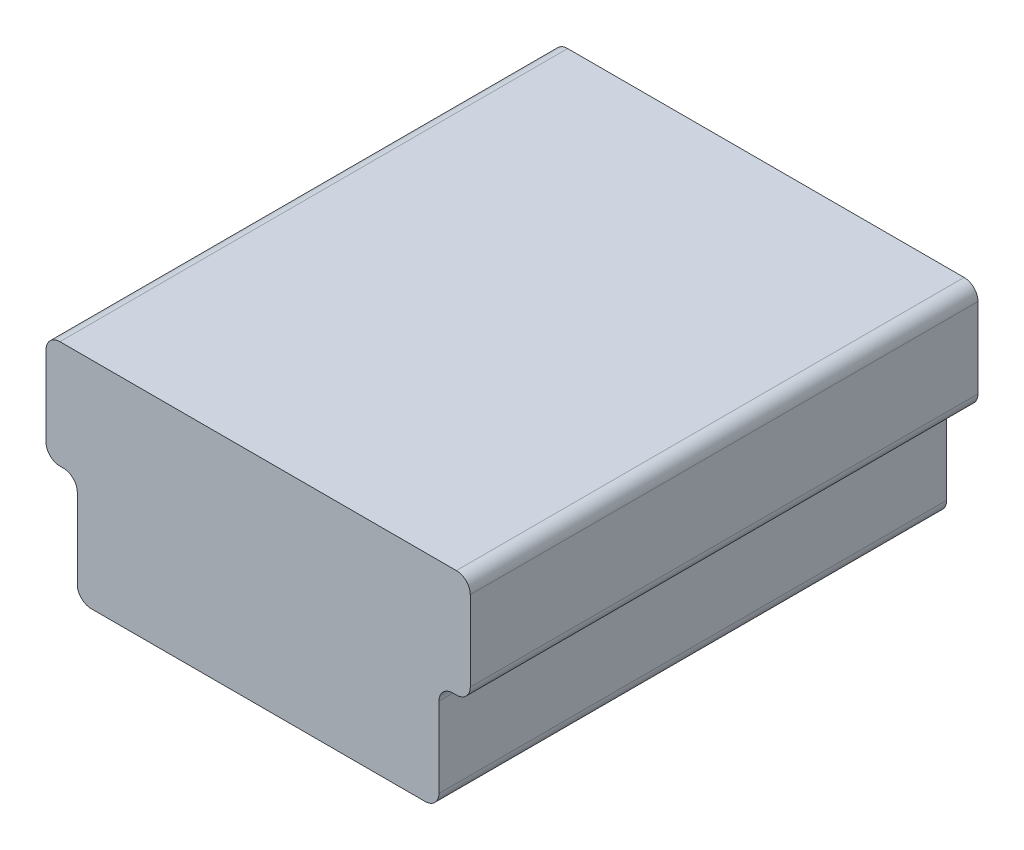
ISO-10303-21;
HEADER;
FILE_DESCRIPTION(('STEP AP214'),'2;1');
FILE_NAME('part.step','',(''),(''),'','','');
FILE_SCHEMA(('AUTOMOTIVE_DESIGN { 1 0 10303 214 1 1 1 1 }'));
ENDSEC;
DATA;
#1=APPLICATION_CONTEXT('core data for automotive mechanical design processes');
#2=APPLICATION_PROTOCOL_DEFINITION('international standard','automotive_design',2000,#1);
#3=PRODUCT_CONTEXT('',#1,'mechanical');
#4=PRODUCT('Part','Part','',(#3));
#5=PRODUCT_RELATED_PRODUCT_CATEGORY('part','',(#4));
#6=PRODUCT_DEFINITION_FORMATION('','',#4);
#7=PRODUCT_DEFINITION_CONTEXT('part definition',#1,'design');
#8=PRODUCT_DEFINITION('design','',#6,#7);
#9=PRODUCT_DEFINITION_SHAPE('','',#8);
#10=(LENGTH_UNIT() NAMED_UNIT(*) SI_UNIT(.MILLI.,.METRE.));
#11=(NAMED_UNIT(*) PLANE_ANGLE_UNIT() SI_UNIT($,.RADIAN.));
#12=(NAMED_UNIT(*) SI_UNIT($,.STERADIAN.) SOLID_ANGLE_UNIT());
#13=UNCERTAINTY_MEASURE_WITH_UNIT(LENGTH_MEASURE(1.E-05),#10,'distance_accuracy_value','');
#14=(GEOMETRIC_REPRESENTATION_CONTEXT(3) GLOBAL_UNCERTAINTY_ASSIGNED_CONTEXT((#13)) GLOBAL_UNIT_ASSIGNED_CONTEXT((#10,
#11,#12)) REPRESENTATION_CONTEXT('',''));
#15=CARTESIAN_POINT('',(0.,0.,0.));
#16=DIRECTION('',(0.,0.,1.));
#17=DIRECTION('',(1.,0.,0.));
#18=AXIS2_PLACEMENT_3D('',#15,#16,#17);
#19=CARTESIAN_POINT('',(-3.556,1.7145,8.89));
#20=DIRECTION('',(0.,0.,1.));
#21=DIRECTION('',(1.,0.,0.));
#22=AXIS2_PLACEMENT_3D('',#19,#20,#21);
#23=PLANE('',#22);
#24=CARTESIAN_POINT('',(-3.556,1.7145,8.89));
#25=DIRECTION('',(0.,0.,1.));
#26=DIRECTION('',(1.,0.,0.));
#27=AXIS2_PLACEMENT_3D('',#24,#25,#26);
#28=CIRCLE('',#27,0.635);
#29=CARTESIAN_POINT('',(-2.921,1.7145,8.89));
#30=VERTEX_POINT('',#29);
#31=CARTESIAN_POINT('',(-3.4925,2.3463170225627,8.89));
#32=VERTEX_POINT('',#31);
#33=EDGE_CURVE('E273',#30,#32,#28,.T.);
#34=ORIENTED_EDGE('',*,*,#33,.T.);
#35=DIRECTION('',(0.,1.,0.));
#36=VECTOR('',#35,1.);
#37=CARTESIAN_POINT('',(-3.4925,2.3463170225627,8.89));
#38=LINE('',#37,#36);
#39=CARTESIAN_POINT('',(-3.4925,3.556,8.89));
#40=VERTEX_POINT('',#39);
#41=EDGE_CURVE('E276',#32,#40,#38,.T.);
#42=ORIENTED_EDGE('',*,*,#41,.T.);
#43=DIRECTION('',(1.,0.,0.));
#44=VECTOR('',#43,1.);
#45=CARTESIAN_POINT('',(-3.4925,3.556,8.89));
#46=LINE('',#45,#44);
#47=CARTESIAN_POINT('',(3.4925,3.556,8.89));
#48=VERTEX_POINT('',#47);
#49=EDGE_CURVE('E280',#40,#48,#46,.T.);
#50=ORIENTED_EDGE('',*,*,#49,.T.);
#51=DIRECTION('',(0.,-1.,0.));
#52=VECTOR('',#51,1.);
#53=CARTESIAN_POINT('',(3.4925,3.556,8.89));
#54=LINE('',#53,#52);
#55=CARTESIAN_POINT('',(3.4925,2.3463170225627,8.89));
#56=VERTEX_POINT('',#55);
#57=EDGE_CURVE('E283',#48,#56,#54,.T.);
#58=ORIENTED_EDGE('',*,*,#57,.T.);
#59=CARTESIAN_POINT('',(3.556,1.7145,8.89));
#60=DIRECTION('',(0.,0.,1.));
#61=DIRECTION('',(1.,0.,0.));
#62=AXIS2_PLACEMENT_3D('',#59,#60,#61);
#63=CIRCLE('',#62,0.635);
#64=CARTESIAN_POINT('',(2.921,1.7145,8.89));
#65=VERTEX_POINT('',#64);
#66=EDGE_CURVE('E286',#56,#65,#63,.T.);
#67=ORIENTED_EDGE('',*,*,#66,.T.);
#68=DIRECTION('',(0.,-1.,0.));
#69=VECTOR('',#68,1.);
#70=CARTESIAN_POINT('',(2.921,1.7145,8.89));
#71=LINE('',#70,#69);
#72=CARTESIAN_POINT('',(2.921,0.381,8.89));
#73=VERTEX_POINT('',#72);
#74=EDGE_CURVE('E289',#65,#73,#71,.T.);
#75=ORIENTED_EDGE('',*,*,#74,.T.);
#76=DIRECTION('',(-1.,0.,0.));
#77=VECTOR('',#76,1.);
#78=CARTESIAN_POINT('',(2.921,0.381,8.89));
#79=LINE('',#78,#77);
#80=CARTESIAN_POINT('',(-2.921,0.381,8.89));
#81=VERTEX_POINT('',#80);
#82=EDGE_CURVE('E292',#73,#81,#79,.T.);
#83=ORIENTED_EDGE('',*,*,#82,.T.);
#84=DIRECTION('',(0.,1.,0.));
#85=VECTOR('',#84,1.);
#86=CARTESIAN_POINT('',(-2.921,0.381,8.89));
#87=LINE('',#86,#85);
#88=EDGE_CURVE('E295',#81,#30,#87,.T.);
#89=ORIENTED_EDGE('',*,*,#88,.T.);
#90=EDGE_LOOP('',(#34,#42,#50,#58,#67,#75,#83,#89));
#91=FACE_BOUND('',#90,.T.);
#92=DIRECTION('',(-1.,0.,0.));
#93=VECTOR('',#92,1.);
#94=CARTESIAN_POINT('',(-2.2225,1.016,8.89));
#95=LINE('',#94,#93);
#96=CARTESIAN_POINT('',(1.7144998984,1.016,8.89));
#97=VERTEX_POINT('',#96);
#98=CARTESIAN_POINT('',(-1.71449989839999,1.016,8.89));
#99=VERTEX_POINT('',#98);
#100=EDGE_CURVE('E263',#97,#99,#95,.T.);
#101=ORIENTED_EDGE('',*,*,#100,.F.);
#102=DIRECTION('',(-0.707106781186539,-0.707106781186556,0.));
#103=VECTOR('',#102,1.);
#104=CARTESIAN_POINT('',(-0.571500050799936,-1.26999994919999,8.89));
#105=LINE('',#104,#103);
#106=CARTESIAN_POINT('',(2.2225,1.52400010160001,8.89));
#107=VERTEX_POINT('',#106);
#108=EDGE_CURVE('E395',#97,#107,#105,.F.);
#109=ORIENTED_EDGE('',*,*,#108,.T.);
#110=DIRECTION('',(0.,-1.,0.));
#111=VECTOR('',#110,1.);
#112=CARTESIAN_POINT('',(2.2225,1.016,8.89));
#113=LINE('',#112,#111);
#114=CARTESIAN_POINT('',(2.2225,2.54,8.89));
#115=VERTEX_POINT('',#114);
#116=EDGE_CURVE('E269',#115,#107,#113,.T.);
#117=ORIENTED_EDGE('',*,*,#116,.F.);
#118=DIRECTION('',(1.,0.,0.));
#119=VECTOR('',#118,1.);
#120=CARTESIAN_POINT('',(2.2225,2.54,8.89));
#121=LINE('',#120,#119);
#122=CARTESIAN_POINT('',(-2.2225,2.54,8.89));
#123=VERTEX_POINT('',#122);
#124=EDGE_CURVE('E267',#123,#115,#121,.T.);
#125=ORIENTED_EDGE('',*,*,#124,.F.);
#126=DIRECTION('',(0.,1.,0.));
#127=VECTOR('',#126,1.);
#128=CARTESIAN_POINT('',(-2.2225,2.54,8.89));
#129=LINE('',#128,#127);
#130=CARTESIAN_POINT('',(-2.2225,1.5240001016,8.89));
#131=VERTEX_POINT('',#130);
#132=EDGE_CURVE('E248',#131,#123,#129,.T.);
#133=ORIENTED_EDGE('',*,*,#132,.F.);
#134=DIRECTION('',(-0.707106781186556,0.707106781186539,0.));
#135=VECTOR('',#134,1.);
#136=CARTESIAN_POINT('',(-2.98449994920002,2.2860000508,8.89));
#137=LINE('',#136,#135);
#138=EDGE_CURVE('E397',#131,#99,#137,.F.);
#139=ORIENTED_EDGE('',*,*,#138,.T.);
#140=EDGE_LOOP('',(#101,#109,#117,#125,#133,#139));
#141=FACE_BOUND('',#140,.T.);
#142=ADVANCED_FACE('F32',(#91,#141),#23,.F.);
#143=CARTESIAN_POINT('',(-3.8735,3.937,9.271));
#144=DIRECTION('',(-1.,0.,0.));
#145=DIRECTION('',(0.,0.,1.));
#146=AXIS2_PLACEMENT_3D('',#143,#144,#145);
#147=PLANE('',#146);
#148=DIRECTION('',(0.,-1.,0.));
#149=VECTOR('',#148,1.);
#150=CARTESIAN_POINT('',(-3.8735,3.937,9.271));
#151=LINE('',#150,#149);
#152=CARTESIAN_POINT('',(-3.8735,3.683,9.271));
#153=VERTEX_POINT('',#152);
#154=CARTESIAN_POINT('',(-3.8735,2.2225,9.271));
#155=VERTEX_POINT('',#154);
#156=EDGE_CURVE('E372',#153,#155,#151,.T.);
#157=ORIENTED_EDGE('',*,*,#156,.F.);
#158=DIRECTION('',(0.,0.,-1.));
#159=VECTOR('',#158,1.);
#160=CARTESIAN_POINT('',(-3.8735,3.683,0.));
#161=LINE('',#160,#159);
#162=CARTESIAN_POINT('',(-3.8735,3.683,0.));
#163=VERTEX_POINT('',#162);
#164=EDGE_CURVE('E452',#153,#163,#161,.T.);
#165=ORIENTED_EDGE('',*,*,#164,.T.);
#166=DIRECTION('',(0.,-1.,0.));
#167=VECTOR('',#166,1.);
#168=CARTESIAN_POINT('',(-3.8735,3.937,0.));
#169=LINE('',#168,#167);
#170=CARTESIAN_POINT('',(-3.8735,2.2225,0.));
#171=VERTEX_POINT('',#170);
#172=EDGE_CURVE('E368',#163,#171,#169,.T.);
#173=ORIENTED_EDGE('',*,*,#172,.T.);
#174=DIRECTION('',(0.,0.,-1.));
#175=VECTOR('',#174,1.);
#176=CARTESIAN_POINT('',(-3.8735,2.2225,9.271));
#177=LINE('',#176,#175);
#178=EDGE_CURVE('E450',#171,#155,#177,.F.);
#179=ORIENTED_EDGE('',*,*,#178,.T.);
#180=EDGE_LOOP('',(#157,#165,#173,#179));
#181=FACE_BOUND('',#180,.T.);
#182=ADVANCED_FACE('F528',(#181),#147,.T.);
#183=CARTESIAN_POINT('',(3.8735,3.937,9.271));
#184=DIRECTION('',(0.,0.,1.));
#185=DIRECTION('',(1.,0.,0.));
#186=AXIS2_PLACEMENT_3D('',#183,#184,#185);
#187=PLANE('',#186);
#188=DIRECTION('',(0.,-1.,0.));
#189=VECTOR('',#188,1.);
#190=CARTESIAN_POINT('',(3.8735,3.937,9.271));
#191=LINE('',#190,#189);
#192=CARTESIAN_POINT('',(3.8735,3.683,9.271));
#193=VERTEX_POINT('',#192);
#194=CARTESIAN_POINT('',(3.8735,2.2225,9.271));
#195=VERTEX_POINT('',#194);
#196=EDGE_CURVE('E376',#193,#195,#191,.T.);
#197=ORIENTED_EDGE('',*,*,#196,.F.);
#198=CARTESIAN_POINT('',(3.6195,3.683,9.271));
#199=DIRECTION('',(0.,0.,1.));
#200=DIRECTION('',(1.,0.,0.));
#201=AXIS2_PLACEMENT_3D('',#198,#199,#200);
#202=CIRCLE('',#201,0.254000000000001);
#203=CARTESIAN_POINT('',(3.6195,3.937,9.271));
#204=VERTEX_POINT('',#203);
#205=EDGE_CURVE('E415',#193,#204,#202,.T.);
#206=ORIENTED_EDGE('',*,*,#205,.T.);
#207=DIRECTION('',(-1.,0.,0.));
#208=VECTOR('',#207,1.);
#209=CARTESIAN_POINT('',(3.8735,3.937,9.271));
#210=LINE('',#209,#208);
#211=CARTESIAN_POINT('',(-3.6195,3.937,9.271));
#212=VERTEX_POINT('',#211);
#213=EDGE_CURVE('E364',#204,#212,#210,.T.);
#214=ORIENTED_EDGE('',*,*,#213,.T.);
#215=CARTESIAN_POINT('',(-3.6195,3.683,9.271));
#216=DIRECTION('',(0.,0.,1.));
#217=DIRECTION('',(1.,0.,0.));
#218=AXIS2_PLACEMENT_3D('',#215,#216,#217);
#219=CIRCLE('',#218,0.254000000000001);
#220=EDGE_CURVE('E409',#212,#153,#219,.T.);
#221=ORIENTED_EDGE('',*,*,#220,.T.);
#222=ORIENTED_EDGE('',*,*,#156,.T.);
#223=CARTESIAN_POINT('',(-3.6195,2.2225,9.271));
#224=DIRECTION('',(0.,0.,1.));
#225=DIRECTION('',(1.,0.,0.));
#226=AXIS2_PLACEMENT_3D('',#223,#224,#225);
#227=CIRCLE('',#226,0.254000000000001);
#228=CARTESIAN_POINT('',(-3.6195,1.9685,9.271));
#229=VERTEX_POINT('',#228);
#230=EDGE_CURVE('E405',#155,#229,#227,.T.);
#231=ORIENTED_EDGE('',*,*,#230,.T.);
#232=DIRECTION('',(1.,0.,0.));
#233=VECTOR('',#232,1.);
#234=CARTESIAN_POINT('',(-3.8735,1.9685,9.271));
#235=LINE('',#234,#233);
#236=CARTESIAN_POINT('',(-3.556,1.9685,9.271));
#237=VERTEX_POINT('',#236);
#238=EDGE_CURVE('E337',#229,#237,#235,.T.);
#239=ORIENTED_EDGE('',*,*,#238,.T.);
#240=CARTESIAN_POINT('',(-3.556,1.7145,9.271));
#241=DIRECTION('',(0.,0.,1.));
#242=DIRECTION('',(1.,0.,0.));
#243=AXIS2_PLACEMENT_3D('',#240,#241,#242);
#244=CIRCLE('',#243,0.254000000000001);
#245=CARTESIAN_POINT('',(-3.302,1.7145,9.271));
#246=VERTEX_POINT('',#245);
#247=EDGE_CURVE('E11',#237,#246,#244,.F.);
#248=ORIENTED_EDGE('',*,*,#247,.T.);
#249=DIRECTION('',(0.,-1.,0.));
#250=VECTOR('',#249,1.);
#251=CARTESIAN_POINT('',(-3.302,1.9685,9.271));
#252=LINE('',#251,#250);
#253=CARTESIAN_POINT('',(-3.302,0.254000000000001,9.271));
#254=VERTEX_POINT('',#253);
#255=EDGE_CURVE('E340',#246,#254,#252,.T.);
#256=ORIENTED_EDGE('',*,*,#255,.T.);
#257=CARTESIAN_POINT('',(-3.048,0.254000000000001,9.271));
#258=DIRECTION('',(0.,0.,1.));
#259=DIRECTION('',(1.,0.,0.));
#260=AXIS2_PLACEMENT_3D('',#257,#258,#259);
#261=CIRCLE('',#260,0.254000000000001);
#262=CARTESIAN_POINT('',(-3.048,0.,9.271));
#263=VERTEX_POINT('',#262);
#264=EDGE_CURVE('E411',#254,#263,#261,.T.);
#265=ORIENTED_EDGE('',*,*,#264,.T.);
#266=DIRECTION('',(-1.,0.,0.));
#267=VECTOR('',#266,1.);
#268=CARTESIAN_POINT('',(3.8735,0.,9.271));
#269=LINE('',#268,#267);
#270=CARTESIAN_POINT('',(3.048,0.,9.271));
#271=VERTEX_POINT('',#270);
#272=EDGE_CURVE('E365',#271,#263,#269,.T.);
#273=ORIENTED_EDGE('',*,*,#272,.F.);
#274=CARTESIAN_POINT('',(3.048,0.254000000000001,9.271));
#275=DIRECTION('',(0.,0.,1.));
#276=DIRECTION('',(1.,0.,0.));
#277=AXIS2_PLACEMENT_3D('',#274,#275,#276);
#278=CIRCLE('',#277,0.254000000000001);
#279=CARTESIAN_POINT('',(3.302,0.254000000000001,9.271));
#280=VERTEX_POINT('',#279);
#281=EDGE_CURVE('E407',#271,#280,#278,.T.);
#282=ORIENTED_EDGE('',*,*,#281,.T.);
#283=DIRECTION('',(0.,1.,0.));
#284=VECTOR('',#283,1.);
#285=CARTESIAN_POINT('',(3.302,0.,9.271));
#286=LINE('',#285,#284);
#287=CARTESIAN_POINT('',(3.302,1.7145,9.271));
#288=VERTEX_POINT('',#287);
#289=EDGE_CURVE('E349',#280,#288,#286,.T.);
#290=ORIENTED_EDGE('',*,*,#289,.T.);
#291=CARTESIAN_POINT('',(3.556,1.7145,9.271));
#292=DIRECTION('',(0.,0.,1.));
#293=DIRECTION('',(1.,0.,0.));
#294=AXIS2_PLACEMENT_3D('',#291,#292,#293);
#295=CIRCLE('',#294,0.254000000000001);
#296=CARTESIAN_POINT('',(3.556,1.9685,9.271));
#297=VERTEX_POINT('',#296);
#298=EDGE_CURVE('E462',#288,#297,#295,.F.);
#299=ORIENTED_EDGE('',*,*,#298,.T.);
#300=DIRECTION('',(1.,0.,0.));
#301=VECTOR('',#300,1.);
#302=CARTESIAN_POINT('',(3.302,1.9685,9.271));
#303=LINE('',#302,#301);
#304=CARTESIAN_POINT('',(3.6195,1.9685,9.271));
#305=VERTEX_POINT('',#304);
#306=EDGE_CURVE('E352',#297,#305,#303,.T.);
#307=ORIENTED_EDGE('',*,*,#306,.T.);
#308=CARTESIAN_POINT('',(3.6195,2.2225,9.271));
#309=DIRECTION('',(0.,0.,1.));
#310=DIRECTION('',(1.,0.,0.));
#311=AXIS2_PLACEMENT_3D('',#308,#309,#310);
#312=CIRCLE('',#311,0.254000000000001);
#313=EDGE_CURVE('E413',#305,#195,#312,.T.);
#314=ORIENTED_EDGE('',*,*,#313,.T.);
#315=EDGE_LOOP('',(#197,#206,#214,#221,#222,#231,#239,#248,#256,#265,#273,#282,#290,#299,#307,#314));
#316=FACE_BOUND('',#315,.T.);
#317=ADVANCED_FACE('F478',(#316),#187,.T.);
#318=CARTESIAN_POINT('',(3.8735,3.937,0.));
#319=DIRECTION('',(1.,0.,0.));
#320=DIRECTION('',(0.,0.,-1.));
#321=AXIS2_PLACEMENT_3D('',#318,#319,#320);
#322=PLANE('',#321);
#323=DIRECTION('',(0.,-1.,0.));
#324=VECTOR('',#323,1.);
#325=CARTESIAN_POINT('',(3.8735,3.937,0.));
#326=LINE('',#325,#324);
#327=CARTESIAN_POINT('',(3.8735,3.683,0.));
#328=VERTEX_POINT('',#327);
#329=CARTESIAN_POINT('',(3.8735,2.2225,0.));
#330=VERTEX_POINT('',#329);
#331=EDGE_CURVE('E379',#328,#330,#326,.T.);
#332=ORIENTED_EDGE('',*,*,#331,.F.);
#333=DIRECTION('',(0.,0.,1.));
#334=VECTOR('',#333,1.);
#335=CARTESIAN_POINT('',(3.8735,3.683,9.271));
#336=LINE('',#335,#334);
#337=EDGE_CURVE('E402',#328,#193,#336,.T.);
#338=ORIENTED_EDGE('',*,*,#337,.T.);
#339=ORIENTED_EDGE('',*,*,#196,.T.);
#340=DIRECTION('',(0.,0.,-1.));
#341=VECTOR('',#340,1.);
#342=CARTESIAN_POINT('',(3.8735,2.2225,0.));
#343=LINE('',#342,#341);
#344=EDGE_CURVE('E399',#195,#330,#343,.T.);
#345=ORIENTED_EDGE('',*,*,#344,.T.);
#346=EDGE_LOOP('',(#332,#338,#339,#345));
#347=FACE_BOUND('',#346,.T.);
#348=ADVANCED_FACE('F510',(#347),#322,.T.);
#349=CARTESIAN_POINT('',(-3.8735,3.937,0.));
#350=DIRECTION('',(0.,0.,-1.));
#351=DIRECTION('',(-1.,0.,0.));
#352=AXIS2_PLACEMENT_3D('',#349,#350,#351);
#353=PLANE('',#352);
#354=CARTESIAN_POINT('',(-3.556,1.7145,0.));
#355=DIRECTION('',(0.,0.,1.));
#356=DIRECTION('',(1.,0.,0.));
#357=AXIS2_PLACEMENT_3D('',#354,#355,#356);
#358=CIRCLE('',#357,0.635);
#359=CARTESIAN_POINT('',(-2.921,1.7145,0.));
#360=VERTEX_POINT('',#359);
#361=CARTESIAN_POINT('',(-3.4925,2.3463170225627,0.));
#362=VERTEX_POINT('',#361);
#363=EDGE_CURVE('E252',#360,#362,#358,.T.);
#364=ORIENTED_EDGE('',*,*,#363,.F.);
#365=DIRECTION('',(0.,1.,0.));
#366=VECTOR('',#365,1.);
#367=CARTESIAN_POINT('',(-2.921,0.381,0.));
#368=LINE('',#367,#366);
#369=CARTESIAN_POINT('',(-2.921,0.381,0.));
#370=VERTEX_POINT('',#369);
#371=EDGE_CURVE('E277',#370,#360,#368,.T.);
#372=ORIENTED_EDGE('',*,*,#371,.F.);
#373=DIRECTION('',(-1.,0.,0.));
#374=VECTOR('',#373,1.);
#375=CARTESIAN_POINT('',(2.921,0.381,0.));
#376=LINE('',#375,#374);
#377=CARTESIAN_POINT('',(2.921,0.381,0.));
#378=VERTEX_POINT('',#377);
#379=EDGE_CURVE('E315',#378,#370,#376,.T.);
#380=ORIENTED_EDGE('',*,*,#379,.F.);
#381=DIRECTION('',(0.,-1.,0.));
#382=VECTOR('',#381,1.);
#383=CARTESIAN_POINT('',(2.921,1.7145,0.));
#384=LINE('',#383,#382);
#385=CARTESIAN_POINT('',(2.921,1.7145,0.));
#386=VERTEX_POINT('',#385);
#387=EDGE_CURVE('E312',#386,#378,#384,.T.);
#388=ORIENTED_EDGE('',*,*,#387,.F.);
#389=CARTESIAN_POINT('',(3.556,1.7145,0.));
#390=DIRECTION('',(0.,0.,1.));
#391=DIRECTION('',(1.,0.,0.));
#392=AXIS2_PLACEMENT_3D('',#389,#390,#391);
#393=CIRCLE('',#392,0.635);
#394=CARTESIAN_POINT('',(3.4925,2.3463170225627,0.));
#395=VERTEX_POINT('',#394);
#396=EDGE_CURVE('E309',#395,#386,#393,.T.);
#397=ORIENTED_EDGE('',*,*,#396,.F.);
#398=DIRECTION('',(0.,-1.,0.));
#399=VECTOR('',#398,1.);
#400=CARTESIAN_POINT('',(3.4925,3.556,0.));
#401=LINE('',#400,#399);
#402=CARTESIAN_POINT('',(3.4925,3.556,0.));
#403=VERTEX_POINT('',#402);
#404=EDGE_CURVE('E306',#403,#395,#401,.T.);
#405=ORIENTED_EDGE('',*,*,#404,.F.);
#406=DIRECTION('',(1.,0.,0.));
#407=VECTOR('',#406,1.);
#408=CARTESIAN_POINT('',(-3.4925,3.556,0.));
#409=LINE('',#408,#407);
#410=CARTESIAN_POINT('',(-3.4925,3.556,0.));
#411=VERTEX_POINT('',#410);
#412=EDGE_CURVE('E303',#411,#403,#409,.T.);
#413=ORIENTED_EDGE('',*,*,#412,.F.);
#414=DIRECTION('',(0.,1.,0.));
#415=VECTOR('',#414,1.);
#416=CARTESIAN_POINT('',(-3.4925,2.3463170225627,0.));
#417=LINE('',#416,#415);
#418=EDGE_CURVE('E300',#362,#411,#417,.T.);
#419=ORIENTED_EDGE('',*,*,#418,.F.);
#420=EDGE_LOOP('',(#364,#372,#380,#388,#397,#405,#413,#419));
#421=FACE_BOUND('',#420,.T.);
#422=DIRECTION('',(1.,0.,0.));
#423=VECTOR('',#422,1.);
#424=CARTESIAN_POINT('',(-3.8735,3.937,0.));
#425=LINE('',#424,#423);
#426=CARTESIAN_POINT('',(-3.6195,3.937,0.));
#427=VERTEX_POINT('',#426);
#428=CARTESIAN_POINT('',(3.6195,3.937,0.));
#429=VERTEX_POINT('',#428);
#430=EDGE_CURVE('E361',#427,#429,#425,.T.);
#431=ORIENTED_EDGE('',*,*,#430,.T.);
#432=CARTESIAN_POINT('',(3.6195,3.683,0.));
#433=DIRECTION('',(0.,0.,-1.));
#434=DIRECTION('',(-1.,0.,0.));
#435=AXIS2_PLACEMENT_3D('',#432,#433,#434);
#436=CIRCLE('',#435,0.254000000000001);
#437=EDGE_CURVE('E429',#429,#328,#436,.T.);
#438=ORIENTED_EDGE('',*,*,#437,.T.);
#439=ORIENTED_EDGE('',*,*,#331,.T.);
#440=CARTESIAN_POINT('',(3.6195,2.2225,0.));
#441=DIRECTION('',(0.,0.,-1.));
#442=DIRECTION('',(-1.,0.,0.));
#443=AXIS2_PLACEMENT_3D('',#440,#441,#442);
#444=CIRCLE('',#443,0.254000000000001);
#445=CARTESIAN_POINT('',(3.6195,1.9685,0.));
#446=VERTEX_POINT('',#445);
#447=EDGE_CURVE('E427',#330,#446,#444,.T.);
#448=ORIENTED_EDGE('',*,*,#447,.T.);
#449=DIRECTION('',(1.,0.,0.));
#450=VECTOR('',#449,1.);
#451=CARTESIAN_POINT('',(3.302,1.9685,0.));
#452=LINE('',#451,#450);
#453=CARTESIAN_POINT('',(3.556,1.9685,0.));
#454=VERTEX_POINT('',#453);
#455=EDGE_CURVE('E353',#454,#446,#452,.T.);
#456=ORIENTED_EDGE('',*,*,#455,.F.);
#457=CARTESIAN_POINT('',(3.556,1.7145,0.));
#458=DIRECTION('',(0.,0.,-1.));
#459=DIRECTION('',(-1.,0.,0.));
#460=AXIS2_PLACEMENT_3D('',#457,#458,#459);
#461=CIRCLE('',#460,0.254000000000001);
#462=CARTESIAN_POINT('',(3.302,1.7145,0.));
#463=VERTEX_POINT('',#462);
#464=EDGE_CURVE('E460',#454,#463,#461,.F.);
#465=ORIENTED_EDGE('',*,*,#464,.T.);
#466=DIRECTION('',(0.,1.,0.));
#467=VECTOR('',#466,1.);
#468=CARTESIAN_POINT('',(3.302,0.,0.));
#469=LINE('',#468,#467);
#470=CARTESIAN_POINT('',(3.302,0.254000000000001,0.));
#471=VERTEX_POINT('',#470);
#472=EDGE_CURVE('E344',#471,#463,#469,.T.);
#473=ORIENTED_EDGE('',*,*,#472,.F.);
#474=CARTESIAN_POINT('',(3.048,0.254000000000001,0.));
#475=DIRECTION('',(0.,0.,-1.));
#476=DIRECTION('',(-1.,0.,0.));
#477=AXIS2_PLACEMENT_3D('',#474,#475,#476);
#478=CIRCLE('',#477,0.254000000000001);
#479=CARTESIAN_POINT('',(3.048,0.,0.));
#480=VERTEX_POINT('',#479);
#481=EDGE_CURVE('E47',#471,#480,#478,.T.);
#482=ORIENTED_EDGE('',*,*,#481,.T.);
#483=DIRECTION('',(1.,0.,0.));
#484=VECTOR('',#483,1.);
#485=CARTESIAN_POINT('',(-3.8735,0.,0.));
#486=LINE('',#485,#484);
#487=CARTESIAN_POINT('',(-3.048,0.,0.));
#488=VERTEX_POINT('',#487);
#489=EDGE_CURVE('E356',#488,#480,#486,.T.);
#490=ORIENTED_EDGE('',*,*,#489,.F.);
#491=CARTESIAN_POINT('',(-3.048,0.254000000000001,0.));
#492=DIRECTION('',(0.,0.,-1.));
#493=DIRECTION('',(-1.,0.,0.));
#494=AXIS2_PLACEMENT_3D('',#491,#492,#493);
#495=CIRCLE('',#494,0.254000000000001);
#496=CARTESIAN_POINT('',(-3.302,0.254000000000001,0.));
#497=VERTEX_POINT('',#496);
#498=EDGE_CURVE('E55',#488,#497,#495,.T.);
#499=ORIENTED_EDGE('',*,*,#498,.T.);
#500=DIRECTION('',(0.,-1.,0.));
#501=VECTOR('',#500,1.);
#502=CARTESIAN_POINT('',(-3.302,1.9685,0.));
#503=LINE('',#502,#501);
#504=CARTESIAN_POINT('',(-3.302,1.7145,0.));
#505=VERTEX_POINT('',#504);
#506=EDGE_CURVE('E341',#505,#497,#503,.T.);
#507=ORIENTED_EDGE('',*,*,#506,.F.);
#508=CARTESIAN_POINT('',(-3.556,1.7145,0.));
#509=DIRECTION('',(0.,0.,-1.));
#510=DIRECTION('',(-1.,0.,0.));
#511=AXIS2_PLACEMENT_3D('',#508,#509,#510);
#512=CIRCLE('',#511,0.254000000000001);
#513=CARTESIAN_POINT('',(-3.556,1.9685,0.));
#514=VERTEX_POINT('',#513);
#515=EDGE_CURVE('E40',#505,#514,#512,.F.);
#516=ORIENTED_EDGE('',*,*,#515,.T.);
#517=DIRECTION('',(1.,0.,0.));
#518=VECTOR('',#517,1.);
#519=CARTESIAN_POINT('',(-3.8735,1.9685,0.));
#520=LINE('',#519,#518);
#521=CARTESIAN_POINT('',(-3.6195,1.9685,0.));
#522=VERTEX_POINT('',#521);
#523=EDGE_CURVE('E322',#522,#514,#520,.T.);
#524=ORIENTED_EDGE('',*,*,#523,.F.);
#525=CARTESIAN_POINT('',(-3.6195,2.2225,0.));
#526=DIRECTION('',(0.,0.,-1.));
#527=DIRECTION('',(-1.,0.,0.));
#528=AXIS2_PLACEMENT_3D('',#525,#526,#527);
#529=CIRCLE('',#528,0.254000000000001);
#530=EDGE_CURVE('E421',#522,#171,#529,.T.);
#531=ORIENTED_EDGE('',*,*,#530,.T.);
#532=ORIENTED_EDGE('',*,*,#172,.F.);
#533=CARTESIAN_POINT('',(-3.6195,3.683,0.));
#534=DIRECTION('',(0.,0.,-1.));
#535=DIRECTION('',(-1.,0.,0.));
#536=AXIS2_PLACEMENT_3D('',#533,#534,#535);
#537=CIRCLE('',#536,0.254000000000001);
#538=EDGE_CURVE('E424',#163,#427,#537,.T.);
#539=ORIENTED_EDGE('',*,*,#538,.T.);
#540=EDGE_LOOP('',(#431,#438,#439,#448,#456,#465,#473,#482,#490,#499,#507,#516,#524,#531,#532,#539));
#541=FACE_BOUND('',#540,.T.);
#542=ADVANCED_FACE('F465',(#421,#541),#353,.T.);
#543=CARTESIAN_POINT('',(-3.8735,3.937,0.));
#544=DIRECTION('',(0.,-1.,0.));
#545=DIRECTION('',(0.,0.,-1.));
#546=AXIS2_PLACEMENT_3D('',#543,#544,#545);
#547=PLANE('',#546);
#548=ORIENTED_EDGE('',*,*,#213,.F.);
#549=DIRECTION('',(0.,0.,1.));
#550=VECTOR('',#549,1.);
#551=CARTESIAN_POINT('',(3.6195,3.937,0.));
#552=LINE('',#551,#550);
#553=EDGE_CURVE('E419',#204,#429,#552,.F.);
#554=ORIENTED_EDGE('',*,*,#553,.T.);
#555=ORIENTED_EDGE('',*,*,#430,.F.);
#556=DIRECTION('',(0.,0.,-1.));
#557=VECTOR('',#556,1.);
#558=CARTESIAN_POINT('',(-3.6195,3.937,9.271));
#559=LINE('',#558,#557);
#560=EDGE_CURVE('E417',#427,#212,#559,.F.);
#561=ORIENTED_EDGE('',*,*,#560,.T.);
#562=EDGE_LOOP('',(#548,#554,#555,#561));
#563=FACE_BOUND('',#562,.T.);
#564=ADVANCED_FACE('F519',(#563),#547,.F.);
#565=CARTESIAN_POINT('',(-3.8735,0.,0.));
#566=DIRECTION('',(0.,-1.,0.));
#567=DIRECTION('',(0.,0.,-1.));
#568=AXIS2_PLACEMENT_3D('',#565,#566,#567);
#569=PLANE('',#568);
#570=ORIENTED_EDGE('',*,*,#272,.T.);
#571=DIRECTION('',(0.,0.,-1.));
#572=VECTOR('',#571,1.);
#573=CARTESIAN_POINT('',(-3.048,0.,0.));
#574=LINE('',#573,#572);
#575=EDGE_CURVE('E438',#263,#488,#574,.T.);
#576=ORIENTED_EDGE('',*,*,#575,.T.);
#577=ORIENTED_EDGE('',*,*,#489,.T.);
#578=DIRECTION('',(0.,0.,-1.));
#579=VECTOR('',#578,1.);
#580=CARTESIAN_POINT('',(3.048,0.,9.271));
#581=LINE('',#580,#579);
#582=EDGE_CURVE('E436',#480,#271,#581,.F.);
#583=ORIENTED_EDGE('',*,*,#582,.T.);
#584=EDGE_LOOP('',(#570,#576,#577,#583));
#585=FACE_BOUND('',#584,.T.);
#586=ADVANCED_FACE('F486',(#585),#569,.T.);
#587=CARTESIAN_POINT('',(3.302,1.9685,9.271));
#588=DIRECTION('',(0.,1.,0.));
#589=DIRECTION('',(0.,0.,1.));
#590=AXIS2_PLACEMENT_3D('',#587,#588,#589);
#591=PLANE('',#590);
#592=ORIENTED_EDGE('',*,*,#455,.T.);
#593=DIRECTION('',(0.,0.,-1.));
#594=VECTOR('',#593,1.);
#595=CARTESIAN_POINT('',(3.6195,1.9685,9.271));
#596=LINE('',#595,#594);
#597=EDGE_CURVE('E434',#446,#305,#596,.F.);
#598=ORIENTED_EDGE('',*,*,#597,.T.);
#599=ORIENTED_EDGE('',*,*,#306,.F.);
#600=DIRECTION('',(0.,0.,-1.));
#601=VECTOR('',#600,1.);
#602=CARTESIAN_POINT('',(3.556,1.9685,0.));
#603=LINE('',#602,#601);
#604=EDGE_CURVE('E431',#297,#454,#603,.T.);
#605=ORIENTED_EDGE('',*,*,#604,.T.);
#606=EDGE_LOOP('',(#592,#598,#599,#605));
#607=FACE_BOUND('',#606,.T.);
#608=ADVANCED_FACE('F502',(#607),#591,.F.);
#609=CARTESIAN_POINT('',(3.302,0.,9.271));
#610=DIRECTION('',(-1.,0.,0.));
#611=DIRECTION('',(0.,-1.,0.));
#612=AXIS2_PLACEMENT_3D('',#609,#610,#611);
#613=PLANE('',#612);
#614=ORIENTED_EDGE('',*,*,#472,.T.);
#615=DIRECTION('',(0.,0.,-1.));
#616=VECTOR('',#615,1.);
#617=CARTESIAN_POINT('',(3.302,1.7145,9.271));
#618=LINE('',#617,#616);
#619=EDGE_CURVE('E448',#463,#288,#618,.F.);
#620=ORIENTED_EDGE('',*,*,#619,.T.);
#621=ORIENTED_EDGE('',*,*,#289,.F.);
#622=DIRECTION('',(0.,0.,-1.));
#623=VECTOR('',#622,1.);
#624=CARTESIAN_POINT('',(3.302,0.254000000000001,0.));
#625=LINE('',#624,#623);
#626=EDGE_CURVE('E445',#280,#471,#625,.T.);
#627=ORIENTED_EDGE('',*,*,#626,.T.);
#628=EDGE_LOOP('',(#614,#620,#621,#627));
#629=FACE_BOUND('',#628,.T.);
#630=ADVANCED_FACE('F494',(#629),#613,.F.);
#631=CARTESIAN_POINT('',(-3.302,1.9685,9.271));
#632=DIRECTION('',(1.,0.,0.));
#633=DIRECTION('',(0.,0.,-1.));
#634=AXIS2_PLACEMENT_3D('',#631,#632,#633);
#635=PLANE('',#634);
#636=ORIENTED_EDGE('',*,*,#506,.T.);
#637=DIRECTION('',(0.,0.,-1.));
#638=VECTOR('',#637,1.);
#639=CARTESIAN_POINT('',(-3.302,0.254000000000001,9.271));
#640=LINE('',#639,#638);
#641=EDGE_CURVE('E443',#497,#254,#640,.F.);
#642=ORIENTED_EDGE('',*,*,#641,.T.);
#643=ORIENTED_EDGE('',*,*,#255,.F.);
#644=DIRECTION('',(0.,0.,-1.));
#645=VECTOR('',#644,1.);
#646=CARTESIAN_POINT('',(-3.302,1.7145,0.));
#647=LINE('',#646,#645);
#648=EDGE_CURVE('E440',#246,#505,#647,.T.);
#649=ORIENTED_EDGE('',*,*,#648,.T.);
#650=EDGE_LOOP('',(#636,#642,#643,#649));
#651=FACE_BOUND('',#650,.T.);
#652=ADVANCED_FACE('F481',(#651),#635,.F.);
#653=CARTESIAN_POINT('',(-3.8735,1.9685,9.271));
#654=DIRECTION('',(0.,1.,0.));
#655=DIRECTION('',(0.,0.,1.));
#656=AXIS2_PLACEMENT_3D('',#653,#654,#655);
#657=PLANE('',#656);
#658=ORIENTED_EDGE('',*,*,#523,.T.);
#659=DIRECTION('',(0.,0.,-1.));
#660=VECTOR('',#659,1.);
#661=CARTESIAN_POINT('',(-3.556,1.9685,9.271));
#662=LINE('',#661,#660);
#663=EDGE_CURVE('E458',#514,#237,#662,.F.);
#664=ORIENTED_EDGE('',*,*,#663,.T.);
#665=ORIENTED_EDGE('',*,*,#238,.F.);
#666=DIRECTION('',(0.,0.,-1.));
#667=VECTOR('',#666,1.);
#668=CARTESIAN_POINT('',(-3.6195,1.9685,0.));
#669=LINE('',#668,#667);
#670=EDGE_CURVE('E455',#229,#522,#669,.T.);
#671=ORIENTED_EDGE('',*,*,#670,.T.);
#672=EDGE_LOOP('',(#658,#664,#665,#671));
#673=FACE_BOUND('',#672,.T.);
#674=ADVANCED_FACE('F470',(#673),#657,.F.);
#675=CARTESIAN_POINT('',(-3.556,1.7145,8.89));
#676=DIRECTION('',(0.,0.,-1.));
#677=DIRECTION('',(-1.,0.,0.));
#678=AXIS2_PLACEMENT_3D('',#675,#676,#677);
#679=CYLINDRICAL_SURFACE('',#678,0.635);
#680=ORIENTED_EDGE('',*,*,#363,.T.);
#681=DIRECTION('',(0.,0.,-1.));
#682=VECTOR('',#681,1.);
#683=CARTESIAN_POINT('',(-3.4925,2.3463170225627,8.89));
#684=LINE('',#683,#682);
#685=EDGE_CURVE('E298',#32,#362,#684,.T.);
#686=ORIENTED_EDGE('',*,*,#685,.F.);
#687=ORIENTED_EDGE('',*,*,#33,.F.);
#688=DIRECTION('',(0.,0.,-1.));
#689=VECTOR('',#688,1.);
#690=CARTESIAN_POINT('',(-2.921,1.7145,8.89));
#691=LINE('',#690,#689);
#692=EDGE_CURVE('E320',#30,#360,#691,.T.);
#693=ORIENTED_EDGE('',*,*,#692,.T.);
#694=EDGE_LOOP('',(#680,#686,#687,#693));
#695=FACE_BOUND('',#694,.T.);
#696=ADVANCED_FACE('F552',(#695),#679,.T.);
#697=CARTESIAN_POINT('',(-2.921,0.381,8.89));
#698=DIRECTION('',(-1.,0.,0.));
#699=DIRECTION('',(0.,0.,1.));
#700=AXIS2_PLACEMENT_3D('',#697,#698,#699);
#701=PLANE('',#700);
#702=ORIENTED_EDGE('',*,*,#371,.T.);
#703=ORIENTED_EDGE('',*,*,#692,.F.);
#704=ORIENTED_EDGE('',*,*,#88,.F.);
#705=DIRECTION('',(0.,0.,-1.));
#706=VECTOR('',#705,1.);
#707=CARTESIAN_POINT('',(-2.921,0.381,8.89));
#708=LINE('',#707,#706);
#709=EDGE_CURVE('E323',#81,#370,#708,.T.);
#710=ORIENTED_EDGE('',*,*,#709,.T.);
#711=EDGE_LOOP('',(#702,#703,#704,#710));
#712=FACE_BOUND('',#711,.T.);
#713=ADVANCED_FACE('F548',(#712),#701,.F.);
#714=CARTESIAN_POINT('',(2.921,0.381,8.89));
#715=DIRECTION('',(0.,-1.,0.));
#716=DIRECTION('',(1.,0.,0.));
#717=AXIS2_PLACEMENT_3D('',#714,#715,#716);
#718=PLANE('',#717);
#719=ORIENTED_EDGE('',*,*,#379,.T.);
#720=ORIENTED_EDGE('',*,*,#709,.F.);
#721=ORIENTED_EDGE('',*,*,#82,.F.);
#722=DIRECTION('',(0.,0.,-1.));
#723=VECTOR('',#722,1.);
#724=CARTESIAN_POINT('',(2.921,0.381,8.89));
#725=LINE('',#724,#723);
#726=EDGE_CURVE('E325',#73,#378,#725,.T.);
#727=ORIENTED_EDGE('',*,*,#726,.T.);
#728=EDGE_LOOP('',(#719,#720,#721,#727));
#729=FACE_BOUND('',#728,.T.);
#730=ADVANCED_FACE('F551',(#729),#718,.F.);
#731=CARTESIAN_POINT('',(2.921,1.7145,8.89));
#732=DIRECTION('',(1.,0.,0.));
#733=DIRECTION('',(0.,0.,-1.));
#734=AXIS2_PLACEMENT_3D('',#731,#732,#733);
#735=PLANE('',#734);
#736=ORIENTED_EDGE('',*,*,#387,.T.);
#737=ORIENTED_EDGE('',*,*,#726,.F.);
#738=ORIENTED_EDGE('',*,*,#74,.F.);
#739=DIRECTION('',(0.,0.,-1.));
#740=VECTOR('',#739,1.);
#741=CARTESIAN_POINT('',(2.921,1.7145,8.89));
#742=LINE('',#741,#740);
#743=EDGE_CURVE('E327',#65,#386,#742,.T.);
#744=ORIENTED_EDGE('',*,*,#743,.T.);
#745=EDGE_LOOP('',(#736,#737,#738,#744));
#746=FACE_BOUND('',#745,.T.);
#747=ADVANCED_FACE('F556',(#746),#735,.F.);
#748=CARTESIAN_POINT('',(3.556,1.7145,8.89));
#749=DIRECTION('',(0.,0.,-1.));
#750=DIRECTION('',(-1.,0.,0.));
#751=AXIS2_PLACEMENT_3D('',#748,#749,#750);
#752=CYLINDRICAL_SURFACE('',#751,0.635);
#753=ORIENTED_EDGE('',*,*,#396,.T.);
#754=ORIENTED_EDGE('',*,*,#743,.F.);
#755=ORIENTED_EDGE('',*,*,#66,.F.);
#756=DIRECTION('',(0.,0.,-1.));
#757=VECTOR('',#756,1.);
#758=CARTESIAN_POINT('',(3.4925,2.3463170225627,8.89));
#759=LINE('',#758,#757);
#760=EDGE_CURVE('E329',#56,#395,#759,.T.);
#761=ORIENTED_EDGE('',*,*,#760,.T.);
#762=EDGE_LOOP('',(#753,#754,#755,#761));
#763=FACE_BOUND('',#762,.T.);
#764=ADVANCED_FACE('F560',(#763),#752,.T.);
#765=CARTESIAN_POINT('',(3.4925,3.556,8.89));
#766=DIRECTION('',(1.,0.,0.));
#767=DIRECTION('',(0.,0.,-1.));
#768=AXIS2_PLACEMENT_3D('',#765,#766,#767);
#769=PLANE('',#768);
#770=ORIENTED_EDGE('',*,*,#404,.T.);
#771=ORIENTED_EDGE('',*,*,#760,.F.);
#772=ORIENTED_EDGE('',*,*,#57,.F.);
#773=DIRECTION('',(0.,0.,-1.));
#774=VECTOR('',#773,1.);
#775=CARTESIAN_POINT('',(3.4925,3.556,8.89));
#776=LINE('',#775,#774);
#777=EDGE_CURVE('E331',#48,#403,#776,.T.);
#778=ORIENTED_EDGE('',*,*,#777,.T.);
#779=EDGE_LOOP('',(#770,#771,#772,#778));
#780=FACE_BOUND('',#779,.T.);
#781=ADVANCED_FACE('F564',(#780),#769,.F.);
#782=CARTESIAN_POINT('',(-3.4925,3.556,8.89));
#783=DIRECTION('',(0.,1.,0.));
#784=DIRECTION('',(0.,0.,1.));
#785=AXIS2_PLACEMENT_3D('',#782,#783,#784);
#786=PLANE('',#785);
#787=ORIENTED_EDGE('',*,*,#412,.T.);
#788=ORIENTED_EDGE('',*,*,#777,.F.);
#789=ORIENTED_EDGE('',*,*,#49,.F.);
#790=DIRECTION('',(0.,0.,-1.));
#791=VECTOR('',#790,1.);
#792=CARTESIAN_POINT('',(-3.4925,3.556,8.89));
#793=LINE('',#792,#791);
#794=EDGE_CURVE('E333',#40,#411,#793,.T.);
#795=ORIENTED_EDGE('',*,*,#794,.T.);
#796=EDGE_LOOP('',(#787,#788,#789,#795));
#797=FACE_BOUND('',#796,.T.);
#798=ADVANCED_FACE('F568',(#797),#786,.F.);
#799=CARTESIAN_POINT('',(-3.4925,2.3463170225627,8.89));
#800=DIRECTION('',(-1.,0.,0.));
#801=DIRECTION('',(0.,0.,1.));
#802=AXIS2_PLACEMENT_3D('',#799,#800,#801);
#803=PLANE('',#802);
#804=ORIENTED_EDGE('',*,*,#418,.T.);
#805=ORIENTED_EDGE('',*,*,#794,.F.);
#806=ORIENTED_EDGE('',*,*,#41,.F.);
#807=ORIENTED_EDGE('',*,*,#685,.T.);
#808=EDGE_LOOP('',(#804,#805,#806,#807));
#809=FACE_BOUND('',#808,.T.);
#810=ADVANCED_FACE('F572',(#809),#803,.F.);
#811=CARTESIAN_POINT('',(-2.2225,1.016,0.888999999999999));
#812=DIRECTION('',(0.,1.,0.));
#813=DIRECTION('',(0.,0.,1.));
#814=AXIS2_PLACEMENT_3D('',#811,#812,#813);
#815=PLANE('',#814);
#816=DIRECTION('',(-1.,0.,0.));
#817=VECTOR('',#816,1.);
#818=CARTESIAN_POINT('',(-2.2225,1.016,0.888999999999999));
#819=LINE('',#818,#817);
#820=CARTESIAN_POINT('',(1.7144998984,1.016,0.888999999999999));
#821=VERTEX_POINT('',#820);
#822=CARTESIAN_POINT('',(-1.71449989839999,1.016,0.888999999999999));
#823=VERTEX_POINT('',#822);
#824=EDGE_CURVE('E242',#821,#823,#819,.T.);
#825=ORIENTED_EDGE('',*,*,#824,.F.);
#826=DIRECTION('',(0.,0.,1.));
#827=VECTOR('',#826,1.);
#828=CARTESIAN_POINT('',(1.7144998984,1.016,0.888999999999999));
#829=LINE('',#828,#827);
#830=EDGE_CURVE('E385',#821,#97,#829,.T.);
#831=ORIENTED_EDGE('',*,*,#830,.T.);
#832=ORIENTED_EDGE('',*,*,#100,.T.);
#833=DIRECTION('',(0.,0.,-1.));
#834=VECTOR('',#833,1.);
#835=CARTESIAN_POINT('',(-1.71449989839999,1.016,0.888999999999999));
#836=LINE('',#835,#834);
#837=EDGE_CURVE('E375',#99,#823,#836,.T.);
#838=ORIENTED_EDGE('',*,*,#837,.T.);
#839=EDGE_LOOP('',(#825,#831,#832,#838));
#840=FACE_BOUND('',#839,.T.);
#841=ADVANCED_FACE('F546',(#840),#815,.F.);
#842=CARTESIAN_POINT('',(-2.2225,2.54,0.888999999999999));
#843=DIRECTION('',(1.,0.,0.));
#844=DIRECTION('',(0.,0.,-1.));
#845=AXIS2_PLACEMENT_3D('',#842,#843,#844);
#846=PLANE('',#845);
#847=DIRECTION('',(0.,1.,0.));
#848=VECTOR('',#847,1.);
#849=CARTESIAN_POINT('',(-2.2225,2.54,0.888999999999999));
#850=LINE('',#849,#848);
#851=CARTESIAN_POINT('',(-2.2225,1.5240001016,0.888999999999999));
#852=VERTEX_POINT('',#851);
#853=CARTESIAN_POINT('',(-2.2225,2.54,0.888999999999999));
#854=VERTEX_POINT('',#853);
#855=EDGE_CURVE('E229',#852,#854,#850,.T.);
#856=ORIENTED_EDGE('',*,*,#855,.F.);
#857=DIRECTION('',(0.,0.,1.));
#858=VECTOR('',#857,1.);
#859=CARTESIAN_POINT('',(-2.2225,1.5240001016,0.888999999999999));
#860=LINE('',#859,#858);
#861=EDGE_CURVE('E393',#852,#131,#860,.T.);
#862=ORIENTED_EDGE('',*,*,#861,.T.);
#863=ORIENTED_EDGE('',*,*,#132,.T.);
#864=DIRECTION('',(0.,0.,1.));
#865=VECTOR('',#864,1.);
#866=CARTESIAN_POINT('',(-2.2225,2.54,0.888999999999999));
#867=LINE('',#866,#865);
#868=EDGE_CURVE('E245',#854,#123,#867,.T.);
#869=ORIENTED_EDGE('',*,*,#868,.F.);
#870=EDGE_LOOP('',(#856,#862,#863,#869));
#871=FACE_BOUND('',#870,.T.);
#872=ADVANCED_FACE('F246',(#871),#846,.F.);
#873=CARTESIAN_POINT('',(2.2225,2.54,0.888999999999999));
#874=DIRECTION('',(0.,-1.,0.));
#875=DIRECTION('',(0.,0.,-1.));
#876=AXIS2_PLACEMENT_3D('',#873,#874,#875);
#877=PLANE('',#876);
#878=ORIENTED_EDGE('',*,*,#124,.T.);
#879=DIRECTION('',(0.,0.,1.));
#880=VECTOR('',#879,1.);
#881=CARTESIAN_POINT('',(2.2225,2.54,0.888999999999999));
#882=LINE('',#881,#880);
#883=CARTESIAN_POINT('',(2.2225,2.54,0.888999999999999));
#884=VERTEX_POINT('',#883);
#885=EDGE_CURVE('E253',#884,#115,#882,.T.);
#886=ORIENTED_EDGE('',*,*,#885,.F.);
#887=DIRECTION('',(1.,0.,0.));
#888=VECTOR('',#887,1.);
#889=CARTESIAN_POINT('',(2.2225,2.54,0.888999999999999));
#890=LINE('',#889,#888);
#891=EDGE_CURVE('E234',#854,#884,#890,.T.);
#892=ORIENTED_EDGE('',*,*,#891,.F.);
#893=ORIENTED_EDGE('',*,*,#868,.T.);
#894=EDGE_LOOP('',(#878,#886,#892,#893));
#895=FACE_BOUND('',#894,.T.);
#896=ADVANCED_FACE('F255',(#895),#877,.F.);
#897=CARTESIAN_POINT('',(2.2225,1.016,0.888999999999999));
#898=DIRECTION('',(-1.,0.,0.));
#899=DIRECTION('',(0.,0.,1.));
#900=AXIS2_PLACEMENT_3D('',#897,#898,#899);
#901=PLANE('',#900);
#902=ORIENTED_EDGE('',*,*,#116,.T.);
#903=DIRECTION('',(0.,0.,-1.));
#904=VECTOR('',#903,1.);
#905=CARTESIAN_POINT('',(2.2225,1.52400010160001,0.888999999999999));
#906=LINE('',#905,#904);
#907=CARTESIAN_POINT('',(2.2225,1.52400010160001,0.888999999999999));
#908=VERTEX_POINT('',#907);
#909=EDGE_CURVE('E388',#107,#908,#906,.T.);
#910=ORIENTED_EDGE('',*,*,#909,.T.);
#911=DIRECTION('',(0.,-1.,0.));
#912=VECTOR('',#911,1.);
#913=CARTESIAN_POINT('',(2.2225,1.016,0.888999999999999));
#914=LINE('',#913,#912);
#915=EDGE_CURVE('E258',#884,#908,#914,.T.);
#916=ORIENTED_EDGE('',*,*,#915,.F.);
#917=ORIENTED_EDGE('',*,*,#885,.T.);
#918=EDGE_LOOP('',(#902,#910,#916,#917));
#919=FACE_BOUND('',#918,.T.);
#920=ADVANCED_FACE('F678',(#919),#901,.F.);
#921=CARTESIAN_POINT('',(2.2225,1.016,0.888999999999999));
#922=DIRECTION('',(0.,0.,1.));
#923=DIRECTION('',(1.,0.,0.));
#924=AXIS2_PLACEMENT_3D('',#921,#922,#923);
#925=PLANE('',#924);
#926=ORIENTED_EDGE('',*,*,#915,.T.);
#927=DIRECTION('',(0.707106781186539,0.707106781186556,0.));
#928=VECTOR('',#927,1.);
#929=CARTESIAN_POINT('',(1.7144998984,1.016,0.888999999999999));
#930=LINE('',#929,#928);
#931=EDGE_CURVE('E391',#908,#821,#930,.F.);
#932=ORIENTED_EDGE('',*,*,#931,.T.);
#933=ORIENTED_EDGE('',*,*,#824,.T.);
#934=DIRECTION('',(0.707106781186556,-0.707106781186539,0.));
#935=VECTOR('',#934,1.);
#936=CARTESIAN_POINT('',(-2.2225,1.5240001016,0.888999999999999));
#937=LINE('',#936,#935);
#938=EDGE_CURVE('E238',#823,#852,#937,.F.);
#939=ORIENTED_EDGE('',*,*,#938,.T.);
#940=ORIENTED_EDGE('',*,*,#855,.T.);
#941=ORIENTED_EDGE('',*,*,#891,.T.);
#942=EDGE_LOOP('',(#926,#932,#933,#939,#940,#941));
#943=FACE_BOUND('',#942,.T.);
#944=ADVANCED_FACE('F232',(#943),#925,.F.);
#945=CARTESIAN_POINT('',(1.7144998984,1.016,0.888999999999999));
#946=DIRECTION('',(-0.707106781186556,0.707106781186539,0.));
#947=DIRECTION('',(-0.707106781186539,-0.707106781186556,0.));
#948=AXIS2_PLACEMENT_3D('',#945,#946,#947);
#949=PLANE('',#948);
#950=ORIENTED_EDGE('',*,*,#931,.F.);
#951=ORIENTED_EDGE('',*,*,#909,.F.);
#952=ORIENTED_EDGE('',*,*,#108,.F.);
#953=ORIENTED_EDGE('',*,*,#830,.F.);
#954=EDGE_LOOP('',(#950,#951,#952,#953));
#955=FACE_BOUND('',#954,.T.);
#956=ADVANCED_FACE('F599',(#955),#949,.F.);
#957=CARTESIAN_POINT('',(-2.2225,1.5240001016,0.888999999999999));
#958=DIRECTION('',(0.707106781186539,0.707106781186556,0.));
#959=DIRECTION('',(-0.707106781186556,0.707106781186539,0.));
#960=AXIS2_PLACEMENT_3D('',#957,#958,#959);
#961=PLANE('',#960);
#962=ORIENTED_EDGE('',*,*,#938,.F.);
#963=ORIENTED_EDGE('',*,*,#837,.F.);
#964=ORIENTED_EDGE('',*,*,#138,.F.);
#965=ORIENTED_EDGE('',*,*,#861,.F.);
#966=EDGE_LOOP('',(#962,#963,#964,#965));
#967=FACE_BOUND('',#966,.T.);
#968=ADVANCED_FACE('F602',(#967),#961,.F.);
#969=CARTESIAN_POINT('',(3.6195,3.683,0.));
#970=DIRECTION('',(0.,0.,-1.));
#971=DIRECTION('',(-1.,0.,0.));
#972=AXIS2_PLACEMENT_3D('',#969,#970,#971);
#973=CYLINDRICAL_SURFACE('',#972,0.254000000000001);
#974=ORIENTED_EDGE('',*,*,#437,.F.);
#975=ORIENTED_EDGE('',*,*,#553,.F.);
#976=ORIENTED_EDGE('',*,*,#205,.F.);
#977=ORIENTED_EDGE('',*,*,#337,.F.);
#978=EDGE_LOOP('',(#974,#975,#976,#977));
#979=FACE_BOUND('',#978,.T.);
#980=ADVANCED_FACE('F514',(#979),#973,.T.);
#981=CARTESIAN_POINT('',(3.6195,2.2225,0.));
#982=DIRECTION('',(0.,0.,1.));
#983=DIRECTION('',(1.,0.,0.));
#984=AXIS2_PLACEMENT_3D('',#981,#982,#983);
#985=CYLINDRICAL_SURFACE('',#984,0.254000000000001);
#986=ORIENTED_EDGE('',*,*,#313,.F.);
#987=ORIENTED_EDGE('',*,*,#597,.F.);
#988=ORIENTED_EDGE('',*,*,#447,.F.);
#989=ORIENTED_EDGE('',*,*,#344,.F.);
#990=EDGE_LOOP('',(#986,#987,#988,#989));
#991=FACE_BOUND('',#990,.T.);
#992=ADVANCED_FACE('F506',(#991),#985,.T.);
#993=CARTESIAN_POINT('',(-3.048,0.254000000000001,0.));
#994=DIRECTION('',(0.,0.,1.));
#995=DIRECTION('',(1.,0.,0.));
#996=AXIS2_PLACEMENT_3D('',#993,#994,#995);
#997=CYLINDRICAL_SURFACE('',#996,0.254000000000001);
#998=ORIENTED_EDGE('',*,*,#264,.F.);
#999=ORIENTED_EDGE('',*,*,#641,.F.);
#1000=ORIENTED_EDGE('',*,*,#498,.F.);
#1001=ORIENTED_EDGE('',*,*,#575,.F.);
#1002=EDGE_LOOP('',(#998,#999,#1000,#1001));
#1003=FACE_BOUND('',#1002,.T.);
#1004=ADVANCED_FACE('F482',(#1003),#997,.T.);
#1005=CARTESIAN_POINT('',(3.556,1.7145,9.271));
#1006=DIRECTION('',(0.,0.,1.));
#1007=DIRECTION('',(1.,0.,0.));
#1008=AXIS2_PLACEMENT_3D('',#1005,#1006,#1007);
#1009=CYLINDRICAL_SURFACE('',#1008,0.254000000000001);
#1010=ORIENTED_EDGE('',*,*,#298,.F.);
#1011=ORIENTED_EDGE('',*,*,#619,.F.);
#1012=ORIENTED_EDGE('',*,*,#464,.F.);
#1013=ORIENTED_EDGE('',*,*,#604,.F.);
#1014=EDGE_LOOP('',(#1010,#1011,#1012,#1013));
#1015=FACE_BOUND('',#1014,.T.);
#1016=ADVANCED_FACE('F497',(#1015),#1009,.F.);
#1017=CARTESIAN_POINT('',(-3.6195,3.683,9.271));
#1018=DIRECTION('',(0.,0.,1.));
#1019=DIRECTION('',(1.,0.,0.));
#1020=AXIS2_PLACEMENT_3D('',#1017,#1018,#1019);
#1021=CYLINDRICAL_SURFACE('',#1020,0.254000000000001);
#1022=ORIENTED_EDGE('',*,*,#220,.F.);
#1023=ORIENTED_EDGE('',*,*,#560,.F.);
#1024=ORIENTED_EDGE('',*,*,#538,.F.);
#1025=ORIENTED_EDGE('',*,*,#164,.F.);
#1026=EDGE_LOOP('',(#1022,#1023,#1024,#1025));
#1027=FACE_BOUND('',#1026,.T.);
#1028=ADVANCED_FACE('F523',(#1027),#1021,.T.);
#1029=CARTESIAN_POINT('',(-3.556,1.7145,9.271));
#1030=DIRECTION('',(0.,0.,1.));
#1031=DIRECTION('',(1.,0.,0.));
#1032=AXIS2_PLACEMENT_3D('',#1029,#1030,#1031);
#1033=CYLINDRICAL_SURFACE('',#1032,0.254000000000001);
#1034=ORIENTED_EDGE('',*,*,#247,.F.);
#1035=ORIENTED_EDGE('',*,*,#663,.F.);
#1036=ORIENTED_EDGE('',*,*,#515,.F.);
#1037=ORIENTED_EDGE('',*,*,#648,.F.);
#1038=EDGE_LOOP('',(#1034,#1035,#1036,#1037));
#1039=FACE_BOUND('',#1038,.T.);
#1040=ADVANCED_FACE('F474',(#1039),#1033,.F.);
#1041=CARTESIAN_POINT('',(3.048,0.254000000000001,9.271));
#1042=DIRECTION('',(0.,0.,1.));
#1043=DIRECTION('',(1.,0.,0.));
#1044=AXIS2_PLACEMENT_3D('',#1041,#1042,#1043);
#1045=CYLINDRICAL_SURFACE('',#1044,0.254000000000001);
#1046=ORIENTED_EDGE('',*,*,#281,.F.);
#1047=ORIENTED_EDGE('',*,*,#582,.F.);
#1048=ORIENTED_EDGE('',*,*,#481,.F.);
#1049=ORIENTED_EDGE('',*,*,#626,.F.);
#1050=EDGE_LOOP('',(#1046,#1047,#1048,#1049));
#1051=FACE_BOUND('',#1050,.T.);
#1052=ADVANCED_FACE('F489',(#1051),#1045,.T.);
#1053=CARTESIAN_POINT('',(-3.6195,2.2225,9.271));
#1054=DIRECTION('',(0.,0.,1.));
#1055=DIRECTION('',(1.,0.,0.));
#1056=AXIS2_PLACEMENT_3D('',#1053,#1054,#1055);
#1057=CYLINDRICAL_SURFACE('',#1056,0.254000000000001);
#1058=ORIENTED_EDGE('',*,*,#230,.F.);
#1059=ORIENTED_EDGE('',*,*,#178,.F.);
#1060=ORIENTED_EDGE('',*,*,#530,.F.);
#1061=ORIENTED_EDGE('',*,*,#670,.F.);
#1062=EDGE_LOOP('',(#1058,#1059,#1060,#1061));
#1063=FACE_BOUND('',#1062,.T.);
#1064=ADVANCED_FACE('F34',(#1063),#1057,.T.);
#1065=CLOSED_SHELL('',(#142,#182,#317,#348,#542,#564,#586,#608,#630,#652,#674,#696,#713,#730,
#747,#764,#781,#798,#810,#841,#872,#896,#920,#944,#956,#968,#980,#992,#1004,#1016,#1028,#1040,
#1052,#1064));
#1066=MANIFOLD_SOLID_BREP('B2',#1065);
#1067=ADVANCED_BREP_SHAPE_REPRESENTATION('',(#18,#1066),#14);
#1068=SHAPE_DEFINITION_REPRESENTATION(#9,#1067);
ENDSEC;
END-ISO-10303-21;
